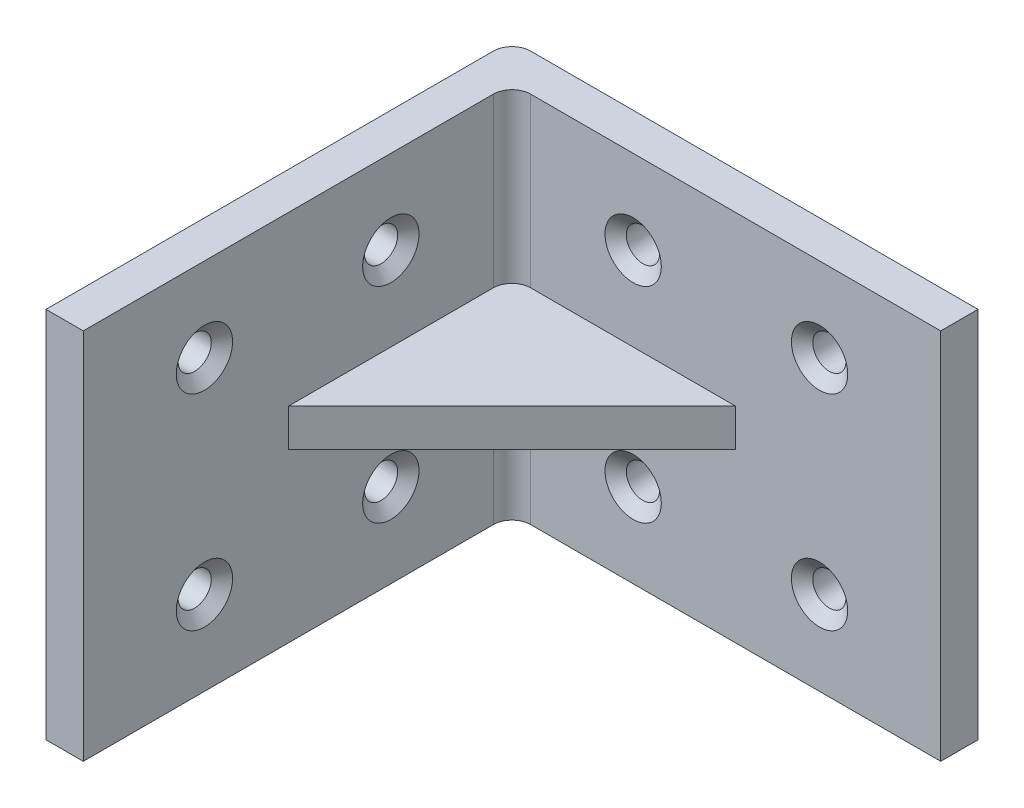
ISO-10303-21;
HEADER;
FILE_DESCRIPTION(('STEP AP214'),'2;1');
FILE_NAME('part.step','',(''),(''),'','','');
FILE_SCHEMA(('AUTOMOTIVE_DESIGN { 1 0 10303 214 1 1 1 1 }'));
ENDSEC;
DATA;
#1=APPLICATION_CONTEXT('core data for automotive mechanical design processes');
#2=APPLICATION_PROTOCOL_DEFINITION('international standard','automotive_design',2000,#1);
#3=PRODUCT_CONTEXT('',#1,'mechanical');
#4=PRODUCT('Part','Part','',(#3));
#5=PRODUCT_RELATED_PRODUCT_CATEGORY('part','',(#4));
#6=PRODUCT_DEFINITION_FORMATION('','',#4);
#7=PRODUCT_DEFINITION_CONTEXT('part definition',#1,'design');
#8=PRODUCT_DEFINITION('design','',#6,#7);
#9=PRODUCT_DEFINITION_SHAPE('','',#8);
#10=(LENGTH_UNIT() NAMED_UNIT(*) SI_UNIT(.MILLI.,.METRE.));
#11=(NAMED_UNIT(*) PLANE_ANGLE_UNIT() SI_UNIT($,.RADIAN.));
#12=(NAMED_UNIT(*) SI_UNIT($,.STERADIAN.) SOLID_ANGLE_UNIT());
#13=UNCERTAINTY_MEASURE_WITH_UNIT(LENGTH_MEASURE(1.E-05),#10,'distance_accuracy_value','');
#14=(GEOMETRIC_REPRESENTATION_CONTEXT(3) GLOBAL_UNCERTAINTY_ASSIGNED_CONTEXT((#13)) GLOBAL_UNIT_ASSIGNED_CONTEXT((#10,
#11,#12)) REPRESENTATION_CONTEXT('',''));
#15=CARTESIAN_POINT('',(0.,0.,0.));
#16=DIRECTION('',(0.,0.,1.));
#17=DIRECTION('',(1.,0.,0.));
#18=AXIS2_PLACEMENT_3D('',#15,#16,#17);
#19=CARTESIAN_POINT('',(-86.9000000000001,29.8824014274328,25.));
#20=DIRECTION('',(-1.,0.,0.));
#21=DIRECTION('',(0.,-1.,0.));
#22=AXIS2_PLACEMENT_3D('',#19,#20,#21);
#23=PLANE('',#22);
#24=DIRECTION('',(0.,1.,0.));
#25=VECTOR('',#24,1.);
#26=CARTESIAN_POINT('',(-86.9000000000001,29.8824014274328,3.));
#27=LINE('',#26,#25);
#28=CARTESIAN_POINT('',(-86.9000000000001,9.8824014274328,3.));
#29=VERTEX_POINT('',#28);
#30=CARTESIAN_POINT('',(-86.9000000000001,18.8824014274328,3.));
#31=VERTEX_POINT('',#30);
#32=EDGE_CURVE('E130',#29,#31,#27,.T.);
#33=ORIENTED_EDGE('',*,*,#32,.T.);
#34=DIRECTION('',(0.,0.,1.));
#35=VECTOR('',#34,1.);
#36=CARTESIAN_POINT('',(-86.9000000000001,18.8824014274328,25.));
#37=LINE('',#36,#35);
#38=CARTESIAN_POINT('',(-86.9000000000001,18.8824014274328,14.));
#39=VERTEX_POINT('',#38);
#40=EDGE_CURVE('E153',#31,#39,#37,.T.);
#41=ORIENTED_EDGE('',*,*,#40,.T.);
#42=DIRECTION('',(0.,-1.,0.));
#43=VECTOR('',#42,1.);
#44=CARTESIAN_POINT('',(-86.9000000000001,29.8824014274328,14.));
#45=LINE('',#44,#43);
#46=CARTESIAN_POINT('',(-86.9000000000001,20.8824014274328,14.));
#47=VERTEX_POINT('',#46);
#48=EDGE_CURVE('E11',#39,#47,#45,.F.);
#49=ORIENTED_EDGE('',*,*,#48,.T.);
#50=DIRECTION('',(0.,0.,1.));
#51=VECTOR('',#50,1.);
#52=CARTESIAN_POINT('',(-86.9000000000001,20.8824014274328,25.));
#53=LINE('',#52,#51);
#54=CARTESIAN_POINT('',(-86.9000000000001,20.8824014274328,3.));
#55=VERTEX_POINT('',#54);
#56=EDGE_CURVE('E134',#55,#47,#53,.T.);
#57=ORIENTED_EDGE('',*,*,#56,.F.);
#58=CARTESIAN_POINT('',(-86.9000000000001,29.8824014274328,3.));
#59=VERTEX_POINT('',#58);
#60=EDGE_CURVE('E120',#55,#59,#27,.T.);
#61=ORIENTED_EDGE('',*,*,#60,.T.);
#62=DIRECTION('',(0.,0.,-1.));
#63=VECTOR('',#62,1.);
#64=CARTESIAN_POINT('',(-86.9000000000001,29.8824014274328,25.));
#65=LINE('',#64,#63);
#66=CARTESIAN_POINT('',(-86.9000000000001,29.8824014274328,25.));
#67=VERTEX_POINT('',#66);
#68=EDGE_CURVE('E168',#67,#59,#65,.T.);
#69=ORIENTED_EDGE('',*,*,#68,.F.);
#70=DIRECTION('',(0.,1.,0.));
#71=VECTOR('',#70,1.);
#72=CARTESIAN_POINT('',(-86.9000000000001,29.8824014274328,25.));
#73=LINE('',#72,#71);
#74=CARTESIAN_POINT('',(-86.9000000000001,9.8824014274328,25.));
#75=VERTEX_POINT('',#74);
#76=EDGE_CURVE('E163',#75,#67,#73,.T.);
#77=ORIENTED_EDGE('',*,*,#76,.F.);
#78=DIRECTION('',(0.,0.,-1.));
#79=VECTOR('',#78,1.);
#80=CARTESIAN_POINT('',(-86.9000000000001,9.8824014274328,25.));
#81=LINE('',#80,#79);
#82=EDGE_CURVE('E188',#75,#29,#81,.T.);
#83=ORIENTED_EDGE('',*,*,#82,.T.);
#84=EDGE_LOOP('',(#33,#41,#49,#57,#61,#69,#77,#83));
#85=FACE_BOUND('',#84,.T.);
#86=CARTESIAN_POINT('',(-86.9,14.3824014274327,18.5));
#87=DIRECTION('',(1.,0.,0.));
#88=DIRECTION('',(0.,0.,-1.));
#89=AXIS2_PLACEMENT_3D('',#86,#87,#88);
#90=CIRCLE('',#89,1.5113);
#91=CARTESIAN_POINT('',(-86.9,14.3824014274327,16.9887));
#92=VERTEX_POINT('',#91);
#93=EDGE_CURVE('E235',#92,#92,#90,.T.);
#94=ORIENTED_EDGE('',*,*,#93,.F.);
#95=EDGE_LOOP('',(#94));
#96=FACE_BOUND('',#95,.T.);
#97=CARTESIAN_POINT('',(-86.9000000000001,14.3824014274328,8.49999999999998));
#98=DIRECTION('',(1.,0.,0.));
#99=DIRECTION('',(0.,0.,-1.));
#100=AXIS2_PLACEMENT_3D('',#97,#98,#99);
#101=CIRCLE('',#100,1.5113);
#102=CARTESIAN_POINT('',(-86.9000000000001,14.3824014274328,6.98869999999998));
#103=VERTEX_POINT('',#102);
#104=EDGE_CURVE('E239',#103,#103,#101,.T.);
#105=ORIENTED_EDGE('',*,*,#104,.F.);
#106=EDGE_LOOP('',(#105));
#107=FACE_BOUND('',#106,.T.);
#108=CARTESIAN_POINT('',(-86.9000000000001,25.3824014274327,18.5));
#109=DIRECTION('',(1.,0.,0.));
#110=DIRECTION('',(0.,0.,-1.));
#111=AXIS2_PLACEMENT_3D('',#108,#109,#110);
#112=CIRCLE('',#111,1.5113);
#113=CARTESIAN_POINT('',(-86.9000000000001,25.3824014274327,16.9887));
#114=VERTEX_POINT('',#113);
#115=EDGE_CURVE('E246',#114,#114,#112,.T.);
#116=ORIENTED_EDGE('',*,*,#115,.F.);
#117=EDGE_LOOP('',(#116));
#118=FACE_BOUND('',#117,.T.);
#119=CARTESIAN_POINT('',(-86.9000000000001,25.3824014274328,8.50000000000001));
#120=DIRECTION('',(1.,0.,0.));
#121=DIRECTION('',(0.,0.,-1.));
#122=AXIS2_PLACEMENT_3D('',#119,#120,#121);
#123=CIRCLE('',#122,1.5113);
#124=CARTESIAN_POINT('',(-86.9000000000001,25.3824014274328,6.98870000000001));
#125=VERTEX_POINT('',#124);
#126=EDGE_CURVE('E596',#125,#125,#123,.T.);
#127=ORIENTED_EDGE('',*,*,#126,.F.);
#128=EDGE_LOOP('',(#127));
#129=FACE_BOUND('',#128,.T.);
#130=ADVANCED_FACE('F32',(#85,#96,#107,#118,#129),#23,.F.);
#131=CARTESIAN_POINT('',(-85.9000000000001,29.8824014274328,3.));
#132=DIRECTION('',(0.,1.,0.));
#133=DIRECTION('',(-1.,0.,0.));
#134=AXIS2_PLACEMENT_3D('',#131,#132,#133);
#135=CYLINDRICAL_SURFACE('',#134,1.);
#136=CARTESIAN_POINT('',(-85.9000000000001,20.8824014274328,3.));
#137=DIRECTION('',(0.,-1.,0.));
#138=DIRECTION('',(0.,0.,-1.));
#139=AXIS2_PLACEMENT_3D('',#136,#137,#138);
#140=CIRCLE('',#139,1.);
#141=CARTESIAN_POINT('',(-85.9000000000001,20.8824014274328,2.));
#142=VERTEX_POINT('',#141);
#143=EDGE_CURVE('E125',#142,#55,#140,.F.);
#144=ORIENTED_EDGE('',*,*,#143,.F.);
#145=DIRECTION('',(0.,1.,0.));
#146=VECTOR('',#145,1.);
#147=CARTESIAN_POINT('',(-85.9000000000001,0.,2.));
#148=LINE('',#147,#146);
#149=CARTESIAN_POINT('',(-85.9000000000001,29.8824014274328,2.));
#150=VERTEX_POINT('',#149);
#151=EDGE_CURVE('E197',#150,#142,#148,.F.);
#152=ORIENTED_EDGE('',*,*,#151,.F.);
#153=CARTESIAN_POINT('',(-85.9000000000001,29.8824014274328,3.));
#154=DIRECTION('',(0.,-1.,0.));
#155=DIRECTION('',(1.,0.,0.));
#156=AXIS2_PLACEMENT_3D('',#153,#154,#155);
#157=CIRCLE('',#156,1.);
#158=EDGE_CURVE('E126',#59,#150,#157,.T.);
#159=ORIENTED_EDGE('',*,*,#158,.F.);
#160=ORIENTED_EDGE('',*,*,#60,.F.);
#161=EDGE_LOOP('',(#144,#152,#159,#160));
#162=FACE_BOUND('',#161,.T.);
#163=ADVANCED_FACE('F122',(#162),#135,.F.);
#164=CARTESIAN_POINT('',(-63.9000000000001,9.8824014274328,2.));
#165=DIRECTION('',(-1.,0.,0.));
#166=DIRECTION('',(0.,0.,1.));
#167=AXIS2_PLACEMENT_3D('',#164,#165,#166);
#168=PLANE('',#167);
#169=DIRECTION('',(0.,1.,0.));
#170=VECTOR('',#169,1.);
#171=CARTESIAN_POINT('',(-63.9000000000001,9.8824014274328,0.));
#172=LINE('',#171,#170);
#173=CARTESIAN_POINT('',(-63.9000000000001,9.8824014274328,0.));
#174=VERTEX_POINT('',#173);
#175=CARTESIAN_POINT('',(-63.9000000000001,29.8824014274328,0.));
#176=VERTEX_POINT('',#175);
#177=EDGE_CURVE('E193',#174,#176,#172,.T.);
#178=ORIENTED_EDGE('',*,*,#177,.T.);
#179=DIRECTION('',(0.,0.,-1.));
#180=VECTOR('',#179,1.);
#181=CARTESIAN_POINT('',(-63.9000000000001,29.8824014274328,2.));
#182=LINE('',#181,#180);
#183=CARTESIAN_POINT('',(-63.9000000000001,29.8824014274328,2.));
#184=VERTEX_POINT('',#183);
#185=EDGE_CURVE('E131',#184,#176,#182,.T.);
#186=ORIENTED_EDGE('',*,*,#185,.F.);
#187=DIRECTION('',(0.,1.,0.));
#188=VECTOR('',#187,1.);
#189=CARTESIAN_POINT('',(-63.9000000000001,9.8824014274328,2.));
#190=LINE('',#189,#188);
#191=CARTESIAN_POINT('',(-63.9000000000001,9.8824014274328,2.));
#192=VERTEX_POINT('',#191);
#193=EDGE_CURVE('E169',#192,#184,#190,.T.);
#194=ORIENTED_EDGE('',*,*,#193,.F.);
#195=DIRECTION('',(0.,0.,-1.));
#196=VECTOR('',#195,1.);
#197=CARTESIAN_POINT('',(-63.9000000000001,9.8824014274328,2.));
#198=LINE('',#197,#196);
#199=EDGE_CURVE('E186',#192,#174,#198,.T.);
#200=ORIENTED_EDGE('',*,*,#199,.T.);
#201=EDGE_LOOP('',(#178,#186,#194,#200));
#202=FACE_BOUND('',#201,.T.);
#203=ADVANCED_FACE('F321',(#202),#168,.F.);
#204=CARTESIAN_POINT('',(-63.9000000000001,29.8824014274328,2.));
#205=DIRECTION('',(0.,-1.,0.));
#206=DIRECTION('',(1.,0.,0.));
#207=AXIS2_PLACEMENT_3D('',#204,#205,#206);
#208=PLANE('',#207);
#209=DIRECTION('',(-1.,0.,0.));
#210=VECTOR('',#209,1.);
#211=CARTESIAN_POINT('',(-63.9000000000001,29.8824014274328,0.));
#212=LINE('',#211,#210);
#213=CARTESIAN_POINT('',(-87.9000000000001,29.8824014274328,0.));
#214=VERTEX_POINT('',#213);
#215=EDGE_CURVE('E367',#176,#214,#212,.T.);
#216=ORIENTED_EDGE('',*,*,#215,.T.);
#217=CARTESIAN_POINT('',(-87.9000000000001,29.8824014274328,1.));
#218=DIRECTION('',(0.,-1.,0.));
#219=DIRECTION('',(1.,0.,0.));
#220=AXIS2_PLACEMENT_3D('',#217,#218,#219);
#221=CIRCLE('',#220,1.);
#222=CARTESIAN_POINT('',(-88.9000000000001,29.8824014274328,1.));
#223=VERTEX_POINT('',#222);
#224=EDGE_CURVE('E204',#214,#223,#221,.F.);
#225=ORIENTED_EDGE('',*,*,#224,.T.);
#226=DIRECTION('',(0.,0.,-1.));
#227=VECTOR('',#226,1.);
#228=CARTESIAN_POINT('',(-88.9000000000001,29.8824014274328,2.));
#229=LINE('',#228,#227);
#230=CARTESIAN_POINT('',(-88.9000000000001,29.8824014274328,25.));
#231=VERTEX_POINT('',#230);
#232=EDGE_CURVE('E353',#231,#223,#229,.T.);
#233=ORIENTED_EDGE('',*,*,#232,.F.);
#234=DIRECTION('',(-1.,0.,0.));
#235=VECTOR('',#234,1.);
#236=CARTESIAN_POINT('',(-88.9000000000001,29.8824014274328,25.));
#237=LINE('',#236,#235);
#238=EDGE_CURVE('E165',#67,#231,#237,.T.);
#239=ORIENTED_EDGE('',*,*,#238,.F.);
#240=ORIENTED_EDGE('',*,*,#68,.T.);
#241=ORIENTED_EDGE('',*,*,#158,.T.);
#242=DIRECTION('',(-1.,0.,0.));
#243=VECTOR('',#242,1.);
#244=CARTESIAN_POINT('',(-63.9000000000001,29.8824014274328,2.));
#245=LINE('',#244,#243);
#246=EDGE_CURVE('E172',#184,#150,#245,.T.);
#247=ORIENTED_EDGE('',*,*,#246,.F.);
#248=ORIENTED_EDGE('',*,*,#185,.T.);
#249=EDGE_LOOP('',(#216,#225,#233,#239,#240,#241,#247,#248));
#250=FACE_BOUND('',#249,.T.);
#251=ADVANCED_FACE('F333',(#250),#208,.F.);
#252=CARTESIAN_POINT('',(-88.9000000000001,9.8824014274328,2.));
#253=DIRECTION('',(-1.,0.,0.));
#254=DIRECTION('',(0.,0.,1.));
#255=AXIS2_PLACEMENT_3D('',#252,#253,#254);
#256=PLANE('',#255);
#257=CARTESIAN_POINT('',(-88.9000000000001,25.3824014274328,8.50000000000001));
#258=DIRECTION('',(-1.,0.,0.));
#259=DIRECTION('',(0.,0.,1.));
#260=AXIS2_PLACEMENT_3D('',#257,#258,#259);
#261=CIRCLE('',#260,0.888999999999992);
#262=CARTESIAN_POINT('',(-88.9000000000001,25.3824014274328,9.389));
#263=VERTEX_POINT('',#262);
#264=EDGE_CURVE('E36',#263,#263,#261,.T.);
#265=ORIENTED_EDGE('',*,*,#264,.F.);
#266=EDGE_LOOP('',(#265));
#267=FACE_BOUND('',#266,.T.);
#268=CARTESIAN_POINT('',(-88.9000000000001,25.3824014274327,18.5));
#269=DIRECTION('',(-1.,0.,0.));
#270=DIRECTION('',(0.,0.,1.));
#271=AXIS2_PLACEMENT_3D('',#268,#269,#270);
#272=CIRCLE('',#271,0.888999999999992);
#273=CARTESIAN_POINT('',(-88.9000000000001,25.3824014274327,19.389));
#274=VERTEX_POINT('',#273);
#275=EDGE_CURVE('E237',#274,#274,#272,.T.);
#276=ORIENTED_EDGE('',*,*,#275,.F.);
#277=EDGE_LOOP('',(#276));
#278=FACE_BOUND('',#277,.T.);
#279=CARTESIAN_POINT('',(-88.9000000000001,14.3824014274328,8.49999999999998));
#280=DIRECTION('',(-1.,0.,0.));
#281=DIRECTION('',(0.,0.,1.));
#282=AXIS2_PLACEMENT_3D('',#279,#280,#281);
#283=CIRCLE('',#282,0.888999999999993);
#284=CARTESIAN_POINT('',(-88.9000000000001,14.3824014274328,9.38899999999998));
#285=VERTEX_POINT('',#284);
#286=EDGE_CURVE('E233',#285,#285,#283,.T.);
#287=ORIENTED_EDGE('',*,*,#286,.F.);
#288=EDGE_LOOP('',(#287));
#289=FACE_BOUND('',#288,.T.);
#290=CARTESIAN_POINT('',(-88.9000000000001,14.3824014274327,18.5));
#291=DIRECTION('',(-1.,0.,0.));
#292=DIRECTION('',(0.,0.,1.));
#293=AXIS2_PLACEMENT_3D('',#290,#291,#292);
#294=CIRCLE('',#293,0.888999999999993);
#295=CARTESIAN_POINT('',(-88.9000000000001,14.3824014274327,19.389));
#296=VERTEX_POINT('',#295);
#297=EDGE_CURVE('E228',#296,#296,#294,.T.);
#298=ORIENTED_EDGE('',*,*,#297,.F.);
#299=EDGE_LOOP('',(#298));
#300=FACE_BOUND('',#299,.T.);
#301=DIRECTION('',(0.,1.,0.));
#302=VECTOR('',#301,1.);
#303=CARTESIAN_POINT('',(-88.9000000000001,9.8824014274328,1.));
#304=LINE('',#303,#302);
#305=CARTESIAN_POINT('',(-88.9000000000001,9.8824014274328,1.));
#306=VERTEX_POINT('',#305);
#307=EDGE_CURVE('E206',#223,#306,#304,.F.);
#308=ORIENTED_EDGE('',*,*,#307,.T.);
#309=DIRECTION('',(0.,0.,-1.));
#310=VECTOR('',#309,1.);
#311=CARTESIAN_POINT('',(-88.9000000000001,9.8824014274328,2.));
#312=LINE('',#311,#310);
#313=CARTESIAN_POINT('',(-88.9000000000001,9.8824014274328,25.));
#314=VERTEX_POINT('',#313);
#315=EDGE_CURVE('E356',#314,#306,#312,.T.);
#316=ORIENTED_EDGE('',*,*,#315,.F.);
#317=DIRECTION('',(0.,-1.,0.));
#318=VECTOR('',#317,1.);
#319=CARTESIAN_POINT('',(-88.9000000000001,29.8824014274328,25.));
#320=LINE('',#319,#318);
#321=EDGE_CURVE('E158',#231,#314,#320,.T.);
#322=ORIENTED_EDGE('',*,*,#321,.F.);
#323=ORIENTED_EDGE('',*,*,#232,.T.);
#324=EDGE_LOOP('',(#308,#316,#322,#323));
#325=FACE_BOUND('',#324,.T.);
#326=ADVANCED_FACE('F329',(#267,#278,#289,#300,#325),#256,.T.);
#327=CARTESIAN_POINT('',(-63.9000000000001,9.8824014274328,2.));
#328=DIRECTION('',(0.,-1.,0.));
#329=DIRECTION('',(0.,0.,-1.));
#330=AXIS2_PLACEMENT_3D('',#327,#328,#329);
#331=PLANE('',#330);
#332=ORIENTED_EDGE('',*,*,#315,.T.);
#333=CARTESIAN_POINT('',(-87.9000000000001,9.8824014274328,1.));
#334=DIRECTION('',(0.,-1.,0.));
#335=DIRECTION('',(0.,0.,-1.));
#336=AXIS2_PLACEMENT_3D('',#333,#334,#335);
#337=CIRCLE('',#336,1.);
#338=CARTESIAN_POINT('',(-87.9000000000001,9.8824014274328,0.));
#339=VERTEX_POINT('',#338);
#340=EDGE_CURVE('E41',#306,#339,#337,.T.);
#341=ORIENTED_EDGE('',*,*,#340,.T.);
#342=DIRECTION('',(-1.,0.,0.));
#343=VECTOR('',#342,1.);
#344=CARTESIAN_POINT('',(-63.9000000000001,9.8824014274328,0.));
#345=LINE('',#344,#343);
#346=EDGE_CURVE('E173',#174,#339,#345,.T.);
#347=ORIENTED_EDGE('',*,*,#346,.F.);
#348=ORIENTED_EDGE('',*,*,#199,.F.);
#349=DIRECTION('',(-1.,0.,0.));
#350=VECTOR('',#349,1.);
#351=CARTESIAN_POINT('',(-63.9000000000001,9.8824014274328,2.));
#352=LINE('',#351,#350);
#353=CARTESIAN_POINT('',(-85.9000000000001,9.8824014274328,2.));
#354=VERTEX_POINT('',#353);
#355=EDGE_CURVE('E182',#192,#354,#352,.T.);
#356=ORIENTED_EDGE('',*,*,#355,.T.);
#357=CARTESIAN_POINT('',(-85.9000000000001,9.8824014274328,3.));
#358=DIRECTION('',(0.,-1.,0.));
#359=DIRECTION('',(0.,0.,-1.));
#360=AXIS2_PLACEMENT_3D('',#357,#358,#359);
#361=CIRCLE('',#360,1.);
#362=EDGE_CURVE('E200',#354,#29,#361,.F.);
#363=ORIENTED_EDGE('',*,*,#362,.T.);
#364=ORIENTED_EDGE('',*,*,#82,.F.);
#365=DIRECTION('',(1.,0.,0.));
#366=VECTOR('',#365,1.);
#367=CARTESIAN_POINT('',(-88.9000000000001,9.8824014274328,25.));
#368=LINE('',#367,#366);
#369=EDGE_CURVE('E161',#314,#75,#368,.T.);
#370=ORIENTED_EDGE('',*,*,#369,.F.);
#371=EDGE_LOOP('',(#332,#341,#347,#348,#356,#363,#364,#370));
#372=FACE_BOUND('',#371,.T.);
#373=ADVANCED_FACE('F290',(#372),#331,.T.);
#374=CARTESIAN_POINT('',(0.,0.,2.));
#375=DIRECTION('',(0.,0.,1.));
#376=DIRECTION('',(1.,0.,0.));
#377=AXIS2_PLACEMENT_3D('',#374,#375,#376);
#378=PLANE('',#377);
#379=CARTESIAN_POINT('',(-80.4000000000001,25.3824014274328,2.));
#380=DIRECTION('',(0.,0.,1.));
#381=DIRECTION('',(1.,0.,0.));
#382=AXIS2_PLACEMENT_3D('',#379,#380,#381);
#383=CIRCLE('',#382,1.51129999999999);
#384=CARTESIAN_POINT('',(-78.8887000000001,25.3824014274328,2.));
#385=VERTEX_POINT('',#384);
#386=EDGE_CURVE('E231',#385,#385,#383,.T.);
#387=ORIENTED_EDGE('',*,*,#386,.F.);
#388=EDGE_LOOP('',(#387));
#389=FACE_BOUND('',#388,.T.);
#390=CARTESIAN_POINT('',(-70.4000000000001,25.3824014274328,2.));
#391=DIRECTION('',(0.,0.,1.));
#392=DIRECTION('',(1.,0.,0.));
#393=AXIS2_PLACEMENT_3D('',#390,#391,#392);
#394=CIRCLE('',#393,1.51130000000001);
#395=CARTESIAN_POINT('',(-68.8887000000001,25.3824014274328,2.));
#396=VERTEX_POINT('',#395);
#397=EDGE_CURVE('E226',#396,#396,#394,.T.);
#398=ORIENTED_EDGE('',*,*,#397,.F.);
#399=EDGE_LOOP('',(#398));
#400=FACE_BOUND('',#399,.T.);
#401=CARTESIAN_POINT('',(-80.4000000000001,14.3824014274328,2.));
#402=DIRECTION('',(0.,0.,1.));
#403=DIRECTION('',(1.,0.,0.));
#404=AXIS2_PLACEMENT_3D('',#401,#402,#403);
#405=CIRCLE('',#404,1.51129999999999);
#406=CARTESIAN_POINT('',(-78.8887000000001,14.3824014274328,2.));
#407=VERTEX_POINT('',#406);
#408=EDGE_CURVE('E221',#407,#407,#405,.T.);
#409=ORIENTED_EDGE('',*,*,#408,.F.);
#410=EDGE_LOOP('',(#409));
#411=FACE_BOUND('',#410,.T.);
#412=CARTESIAN_POINT('',(-70.4000000000001,14.3824014274328,2.));
#413=DIRECTION('',(0.,0.,1.));
#414=DIRECTION('',(1.,0.,0.));
#415=AXIS2_PLACEMENT_3D('',#412,#413,#414);
#416=CIRCLE('',#415,1.51130000000001);
#417=CARTESIAN_POINT('',(-68.8887000000001,14.3824014274328,2.));
#418=VERTEX_POINT('',#417);
#419=EDGE_CURVE('E216',#418,#418,#416,.T.);
#420=ORIENTED_EDGE('',*,*,#419,.F.);
#421=EDGE_LOOP('',(#420));
#422=FACE_BOUND('',#421,.T.);
#423=DIRECTION('',(1.,0.,0.));
#424=VECTOR('',#423,1.);
#425=CARTESIAN_POINT('',(0.,18.8824014274328,2.));
#426=LINE('',#425,#424);
#427=CARTESIAN_POINT('',(-85.9000000000001,18.8824014274328,2.));
#428=VERTEX_POINT('',#427);
#429=CARTESIAN_POINT('',(-74.9000000000001,18.8824014274328,2.));
#430=VERTEX_POINT('',#429);
#431=EDGE_CURVE('E155',#428,#430,#426,.T.);
#432=ORIENTED_EDGE('',*,*,#431,.F.);
#433=EDGE_CURVE('E196',#428,#354,#148,.F.);
#434=ORIENTED_EDGE('',*,*,#433,.T.);
#435=ORIENTED_EDGE('',*,*,#355,.F.);
#436=ORIENTED_EDGE('',*,*,#193,.T.);
#437=ORIENTED_EDGE('',*,*,#246,.T.);
#438=ORIENTED_EDGE('',*,*,#151,.T.);
#439=DIRECTION('',(1.,0.,0.));
#440=VECTOR('',#439,1.);
#441=CARTESIAN_POINT('',(0.,20.8824014274328,2.));
#442=LINE('',#441,#440);
#443=CARTESIAN_POINT('',(-74.9000000000001,20.8824014274328,2.));
#444=VERTEX_POINT('',#443);
#445=EDGE_CURVE('E54',#142,#444,#442,.T.);
#446=ORIENTED_EDGE('',*,*,#445,.T.);
#447=DIRECTION('',(0.,-1.,0.));
#448=VECTOR('',#447,1.);
#449=CARTESIAN_POINT('',(-74.9000000000001,0.,2.));
#450=LINE('',#449,#448);
#451=EDGE_CURVE('E49',#430,#444,#450,.F.);
#452=ORIENTED_EDGE('',*,*,#451,.F.);
#453=EDGE_LOOP('',(#432,#434,#435,#436,#437,#438,#446,#452));
#454=FACE_BOUND('',#453,.T.);
#455=ADVANCED_FACE('F287',(#389,#400,#411,#422,#454),#378,.T.);
#456=CARTESIAN_POINT('',(0.,0.,0.));
#457=DIRECTION('',(0.,0.,1.));
#458=DIRECTION('',(1.,0.,0.));
#459=AXIS2_PLACEMENT_3D('',#456,#457,#458);
#460=PLANE('',#459);
#461=CARTESIAN_POINT('',(-80.4000000000001,25.3824014274328,0.));
#462=DIRECTION('',(0.,0.,1.));
#463=DIRECTION('',(1.,0.,0.));
#464=AXIS2_PLACEMENT_3D('',#461,#462,#463);
#465=CIRCLE('',#464,0.888999999999994);
#466=CARTESIAN_POINT('',(-79.5110000000001,25.3824014274328,0.));
#467=VERTEX_POINT('',#466);
#468=EDGE_CURVE('E223',#467,#467,#465,.T.);
#469=ORIENTED_EDGE('',*,*,#468,.T.);
#470=EDGE_LOOP('',(#469));
#471=FACE_BOUND('',#470,.T.);
#472=CARTESIAN_POINT('',(-70.4000000000001,25.3824014274328,0.));
#473=DIRECTION('',(0.,0.,1.));
#474=DIRECTION('',(1.,0.,0.));
#475=AXIS2_PLACEMENT_3D('',#472,#473,#474);
#476=CIRCLE('',#475,0.888999999999994);
#477=CARTESIAN_POINT('',(-69.5110000000001,25.3824014274328,0.));
#478=VERTEX_POINT('',#477);
#479=EDGE_CURVE('E218',#478,#478,#476,.T.);
#480=ORIENTED_EDGE('',*,*,#479,.T.);
#481=EDGE_LOOP('',(#480));
#482=FACE_BOUND('',#481,.T.);
#483=CARTESIAN_POINT('',(-80.4000000000001,14.3824014274328,0.));
#484=DIRECTION('',(0.,0.,1.));
#485=DIRECTION('',(1.,0.,0.));
#486=AXIS2_PLACEMENT_3D('',#483,#484,#485);
#487=CIRCLE('',#486,0.888999999999994);
#488=CARTESIAN_POINT('',(-79.5110000000001,14.3824014274328,0.));
#489=VERTEX_POINT('',#488);
#490=EDGE_CURVE('E213',#489,#489,#487,.T.);
#491=ORIENTED_EDGE('',*,*,#490,.T.);
#492=EDGE_LOOP('',(#491));
#493=FACE_BOUND('',#492,.T.);
#494=CARTESIAN_POINT('',(-70.4000000000001,14.3824014274328,0.));
#495=DIRECTION('',(0.,0.,1.));
#496=DIRECTION('',(1.,0.,0.));
#497=AXIS2_PLACEMENT_3D('',#494,#495,#496);
#498=CIRCLE('',#497,0.888999999999994);
#499=CARTESIAN_POINT('',(-69.5110000000001,14.3824014274328,0.));
#500=VERTEX_POINT('',#499);
#501=EDGE_CURVE('E209',#500,#500,#498,.T.);
#502=ORIENTED_EDGE('',*,*,#501,.T.);
#503=EDGE_LOOP('',(#502));
#504=FACE_BOUND('',#503,.T.);
#505=DIRECTION('',(0.,1.,0.));
#506=VECTOR('',#505,1.);
#507=CARTESIAN_POINT('',(-87.9000000000001,29.8824014274328,0.));
#508=LINE('',#507,#506);
#509=EDGE_CURVE('E202',#339,#214,#508,.T.);
#510=ORIENTED_EDGE('',*,*,#509,.T.);
#511=ORIENTED_EDGE('',*,*,#215,.F.);
#512=ORIENTED_EDGE('',*,*,#177,.F.);
#513=ORIENTED_EDGE('',*,*,#346,.T.);
#514=EDGE_LOOP('',(#510,#511,#512,#513));
#515=FACE_BOUND('',#514,.T.);
#516=ADVANCED_FACE('F289',(#471,#482,#493,#504,#515),#460,.F.);
#517=CARTESIAN_POINT('',(0.,0.,25.));
#518=DIRECTION('',(0.,0.,1.));
#519=DIRECTION('',(1.,0.,0.));
#520=AXIS2_PLACEMENT_3D('',#517,#518,#519);
#521=PLANE('',#520);
#522=ORIENTED_EDGE('',*,*,#321,.T.);
#523=ORIENTED_EDGE('',*,*,#369,.T.);
#524=ORIENTED_EDGE('',*,*,#76,.T.);
#525=ORIENTED_EDGE('',*,*,#238,.T.);
#526=EDGE_LOOP('',(#522,#523,#524,#525));
#527=FACE_BOUND('',#526,.T.);
#528=ADVANCED_FACE('F322',(#527),#521,.T.);
#529=ORIENTED_EDGE('',*,*,#433,.F.);
#530=CARTESIAN_POINT('',(-85.9000000000001,18.8824014274328,3.));
#531=DIRECTION('',(0.,-1.,0.));
#532=DIRECTION('',(0.,0.,-1.));
#533=AXIS2_PLACEMENT_3D('',#530,#531,#532);
#534=CIRCLE('',#533,1.);
#535=EDGE_CURVE('E151',#428,#31,#534,.F.);
#536=ORIENTED_EDGE('',*,*,#535,.T.);
#537=ORIENTED_EDGE('',*,*,#32,.F.);
#538=ORIENTED_EDGE('',*,*,#362,.F.);
#539=EDGE_LOOP('',(#529,#536,#537,#538));
#540=FACE_BOUND('',#539,.T.);
#541=ADVANCED_FACE('F300',(#540),#135,.F.);
#542=CARTESIAN_POINT('',(-87.9000000000001,0.,1.));
#543=DIRECTION('',(0.,-1.,0.));
#544=DIRECTION('',(0.,0.,-1.));
#545=AXIS2_PLACEMENT_3D('',#542,#543,#544);
#546=CYLINDRICAL_SURFACE('',#545,1.);
#547=ORIENTED_EDGE('',*,*,#340,.F.);
#548=ORIENTED_EDGE('',*,*,#307,.F.);
#549=ORIENTED_EDGE('',*,*,#224,.F.);
#550=ORIENTED_EDGE('',*,*,#509,.F.);
#551=EDGE_LOOP('',(#547,#548,#549,#550));
#552=FACE_BOUND('',#551,.T.);
#553=ADVANCED_FACE('F34',(#552),#546,.T.);
#554=CARTESIAN_POINT('',(-86.9000000000001,19.8824014274328,14.));
#555=DIRECTION('',(-0.707106781186548,0.,-0.707106781186547));
#556=DIRECTION('',(0.707106781186547,0.,-0.707106781186548));
#557=AXIS2_PLACEMENT_3D('',#554,#555,#556);
#558=PLANE('',#557);
#559=DIRECTION('',(0.707106781186547,0.,-0.707106781186548));
#560=VECTOR('',#559,1.);
#561=CARTESIAN_POINT('',(-86.9000000000001,18.8824014274328,14.));
#562=LINE('',#561,#560);
#563=EDGE_CURVE('E143',#39,#430,#562,.T.);
#564=ORIENTED_EDGE('',*,*,#563,.T.);
#565=ORIENTED_EDGE('',*,*,#451,.T.);
#566=DIRECTION('',(0.707106781186547,0.,-0.707106781186548));
#567=VECTOR('',#566,1.);
#568=CARTESIAN_POINT('',(-86.9000000000001,20.8824014274328,14.));
#569=LINE('',#568,#567);
#570=EDGE_CURVE('E146',#47,#444,#569,.T.);
#571=ORIENTED_EDGE('',*,*,#570,.F.);
#572=ORIENTED_EDGE('',*,*,#48,.F.);
#573=EDGE_LOOP('',(#564,#565,#571,#572));
#574=FACE_BOUND('',#573,.T.);
#575=ADVANCED_FACE('F305',(#574),#558,.F.);
#576=CARTESIAN_POINT('',(-76.4000000000001,18.8824014274328,12.5));
#577=DIRECTION('',(0.,-1.,0.));
#578=DIRECTION('',(0.,0.,-1.));
#579=AXIS2_PLACEMENT_3D('',#576,#577,#578);
#580=PLANE('',#579);
#581=ORIENTED_EDGE('',*,*,#535,.F.);
#582=ORIENTED_EDGE('',*,*,#431,.T.);
#583=ORIENTED_EDGE('',*,*,#563,.F.);
#584=ORIENTED_EDGE('',*,*,#40,.F.);
#585=EDGE_LOOP('',(#581,#582,#583,#584));
#586=FACE_BOUND('',#585,.T.);
#587=ADVANCED_FACE('F303',(#586),#580,.T.);
#588=CARTESIAN_POINT('',(-76.4000000000001,20.8824014274328,12.5));
#589=DIRECTION('',(0.,-1.,0.));
#590=DIRECTION('',(0.,0.,-1.));
#591=AXIS2_PLACEMENT_3D('',#588,#589,#590);
#592=PLANE('',#591);
#593=ORIENTED_EDGE('',*,*,#445,.F.);
#594=ORIENTED_EDGE('',*,*,#143,.T.);
#595=ORIENTED_EDGE('',*,*,#56,.T.);
#596=ORIENTED_EDGE('',*,*,#570,.T.);
#597=EDGE_LOOP('',(#593,#594,#595,#596));
#598=FACE_BOUND('',#597,.T.);
#599=ADVANCED_FACE('F142',(#598),#592,.F.);
#600=CARTESIAN_POINT('',(-70.4000000000001,14.3824014274328,2.));
#601=DIRECTION('',(0.,0.,1.));
#602=DIRECTION('',(1.,0.,0.));
#603=AXIS2_PLACEMENT_3D('',#600,#601,#602);
#604=CYLINDRICAL_SURFACE('',#603,0.888999999999994);
#605=CARTESIAN_POINT('',(-70.4000000000001,14.3824014274328,1.47782829951838));
#606=DIRECTION('',(0.,0.,1.));
#607=DIRECTION('',(1.,0.,0.));
#608=AXIS2_PLACEMENT_3D('',#605,#606,#607);
#609=CIRCLE('',#608,0.889000000000001);
#610=CARTESIAN_POINT('',(-69.5110000000001,14.3824014274328,1.47782829951838));
#611=VERTEX_POINT('',#610);
#612=EDGE_CURVE('E212',#611,#611,#609,.T.);
#613=ORIENTED_EDGE('',*,*,#612,.T.);
#614=EDGE_LOOP('',(#613));
#615=FACE_BOUND('',#614,.T.);
#616=ORIENTED_EDGE('',*,*,#501,.F.);
#617=EDGE_LOOP('',(#616));
#618=FACE_BOUND('',#617,.T.);
#619=ADVANCED_FACE('F277',(#615,#618),#604,.F.);
#620=CARTESIAN_POINT('',(-70.4000000000001,14.3824014274328,2.));
#621=DIRECTION('',(0.,0.,1.));
#622=DIRECTION('',(1.,0.,0.));
#623=AXIS2_PLACEMENT_3D('',#620,#621,#622);
#624=CONICAL_SURFACE('',#623,1.51130000000001,0.872664625997165);
#625=ORIENTED_EDGE('',*,*,#612,.F.);
#626=EDGE_LOOP('',(#625));
#627=FACE_BOUND('',#626,.T.);
#628=ORIENTED_EDGE('',*,*,#419,.T.);
#629=EDGE_LOOP('',(#628));
#630=FACE_BOUND('',#629,.T.);
#631=ADVANCED_FACE('F280',(#627,#630),#624,.F.);
#632=CARTESIAN_POINT('',(-80.4000000000001,14.3824014274328,2.));
#633=DIRECTION('',(0.,0.,1.));
#634=DIRECTION('',(1.,0.,0.));
#635=AXIS2_PLACEMENT_3D('',#632,#633,#634);
#636=CYLINDRICAL_SURFACE('',#635,0.888999999999994);
#637=CARTESIAN_POINT('',(-80.4000000000001,14.3824014274328,1.47782829951838));
#638=DIRECTION('',(0.,0.,1.));
#639=DIRECTION('',(1.,0.,0.));
#640=AXIS2_PLACEMENT_3D('',#637,#638,#639);
#641=CIRCLE('',#640,0.889000000000001);
#642=CARTESIAN_POINT('',(-79.5110000000001,14.3824014274328,1.47782829951838));
#643=VERTEX_POINT('',#642);
#644=EDGE_CURVE('E217',#643,#643,#641,.T.);
#645=ORIENTED_EDGE('',*,*,#644,.T.);
#646=EDGE_LOOP('',(#645));
#647=FACE_BOUND('',#646,.T.);
#648=ORIENTED_EDGE('',*,*,#490,.F.);
#649=EDGE_LOOP('',(#648));
#650=FACE_BOUND('',#649,.T.);
#651=ADVANCED_FACE('F283',(#647,#650),#636,.F.);
#652=CARTESIAN_POINT('',(-80.4000000000001,14.3824014274328,2.));
#653=DIRECTION('',(0.,0.,1.));
#654=DIRECTION('',(1.,0.,0.));
#655=AXIS2_PLACEMENT_3D('',#652,#653,#654);
#656=CONICAL_SURFACE('',#655,1.51129999999999,0.872664625997154);
#657=ORIENTED_EDGE('',*,*,#644,.F.);
#658=EDGE_LOOP('',(#657));
#659=FACE_BOUND('',#658,.T.);
#660=ORIENTED_EDGE('',*,*,#408,.T.);
#661=EDGE_LOOP('',(#660));
#662=FACE_BOUND('',#661,.T.);
#663=ADVANCED_FACE('F455',(#659,#662),#656,.F.);
#664=CARTESIAN_POINT('',(-70.4000000000001,25.3824014274328,2.));
#665=DIRECTION('',(0.,0.,1.));
#666=DIRECTION('',(1.,0.,0.));
#667=AXIS2_PLACEMENT_3D('',#664,#665,#666);
#668=CYLINDRICAL_SURFACE('',#667,0.888999999999994);
#669=CARTESIAN_POINT('',(-70.4000000000001,25.3824014274328,1.47782829951838));
#670=DIRECTION('',(0.,0.,1.));
#671=DIRECTION('',(1.,0.,0.));
#672=AXIS2_PLACEMENT_3D('',#669,#670,#671);
#673=CIRCLE('',#672,0.889000000000001);
#674=CARTESIAN_POINT('',(-69.5110000000001,25.3824014274328,1.47782829951838));
#675=VERTEX_POINT('',#674);
#676=EDGE_CURVE('E222',#675,#675,#673,.T.);
#677=ORIENTED_EDGE('',*,*,#676,.T.);
#678=EDGE_LOOP('',(#677));
#679=FACE_BOUND('',#678,.T.);
#680=ORIENTED_EDGE('',*,*,#479,.F.);
#681=EDGE_LOOP('',(#680));
#682=FACE_BOUND('',#681,.T.);
#683=ADVANCED_FACE('F464',(#679,#682),#668,.F.);
#684=CARTESIAN_POINT('',(-70.4000000000001,25.3824014274328,2.));
#685=DIRECTION('',(0.,0.,1.));
#686=DIRECTION('',(1.,0.,0.));
#687=AXIS2_PLACEMENT_3D('',#684,#685,#686);
#688=CONICAL_SURFACE('',#687,1.51130000000001,0.872664625997165);
#689=ORIENTED_EDGE('',*,*,#676,.F.);
#690=EDGE_LOOP('',(#689));
#691=FACE_BOUND('',#690,.T.);
#692=ORIENTED_EDGE('',*,*,#397,.T.);
#693=EDGE_LOOP('',(#692));
#694=FACE_BOUND('',#693,.T.);
#695=ADVANCED_FACE('F474',(#691,#694),#688,.F.);
#696=CARTESIAN_POINT('',(-80.4000000000001,25.3824014274328,2.));
#697=DIRECTION('',(0.,0.,1.));
#698=DIRECTION('',(1.,0.,0.));
#699=AXIS2_PLACEMENT_3D('',#696,#697,#698);
#700=CYLINDRICAL_SURFACE('',#699,0.888999999999994);
#701=CARTESIAN_POINT('',(-80.4000000000001,25.3824014274328,1.47782829951838));
#702=DIRECTION('',(0.,0.,1.));
#703=DIRECTION('',(1.,0.,0.));
#704=AXIS2_PLACEMENT_3D('',#701,#702,#703);
#705=CIRCLE('',#704,0.889000000000001);
#706=CARTESIAN_POINT('',(-79.5110000000001,25.3824014274328,1.47782829951838));
#707=VERTEX_POINT('',#706);
#708=EDGE_CURVE('E227',#707,#707,#705,.T.);
#709=ORIENTED_EDGE('',*,*,#708,.T.);
#710=EDGE_LOOP('',(#709));
#711=FACE_BOUND('',#710,.T.);
#712=ORIENTED_EDGE('',*,*,#468,.F.);
#713=EDGE_LOOP('',(#712));
#714=FACE_BOUND('',#713,.T.);
#715=ADVANCED_FACE('F481',(#711,#714),#700,.F.);
#716=CARTESIAN_POINT('',(-80.4000000000001,25.3824014274328,2.));
#717=DIRECTION('',(0.,0.,1.));
#718=DIRECTION('',(1.,0.,0.));
#719=AXIS2_PLACEMENT_3D('',#716,#717,#718);
#720=CONICAL_SURFACE('',#719,1.51129999999999,0.872664625997154);
#721=ORIENTED_EDGE('',*,*,#708,.F.);
#722=EDGE_LOOP('',(#721));
#723=FACE_BOUND('',#722,.T.);
#724=ORIENTED_EDGE('',*,*,#386,.T.);
#725=EDGE_LOOP('',(#724));
#726=FACE_BOUND('',#725,.T.);
#727=ADVANCED_FACE('F489',(#723,#726),#720,.F.);
#728=CARTESIAN_POINT('',(-86.9,14.3824014274327,18.5));
#729=DIRECTION('',(1.,0.,0.));
#730=DIRECTION('',(0.,0.,-1.));
#731=AXIS2_PLACEMENT_3D('',#728,#729,#730);
#732=CYLINDRICAL_SURFACE('',#731,0.888999999999993);
#733=ORIENTED_EDGE('',*,*,#297,.T.);
#734=EDGE_LOOP('',(#733));
#735=FACE_BOUND('',#734,.T.);
#736=CARTESIAN_POINT('',(-87.4221717004817,14.3824014274327,18.5));
#737=DIRECTION('',(1.,0.,0.));
#738=DIRECTION('',(0.,0.,-1.));
#739=AXIS2_PLACEMENT_3D('',#736,#737,#738);
#740=CIRCLE('',#739,0.888999999999999);
#741=CARTESIAN_POINT('',(-87.4221717004817,14.3824014274327,17.611));
#742=VERTEX_POINT('',#741);
#743=EDGE_CURVE('E232',#742,#742,#740,.T.);
#744=ORIENTED_EDGE('',*,*,#743,.T.);
#745=EDGE_LOOP('',(#744));
#746=FACE_BOUND('',#745,.T.);
#747=ADVANCED_FACE('F497',(#735,#746),#732,.F.);
#748=CARTESIAN_POINT('',(-86.9,14.3824014274327,18.5));
#749=DIRECTION('',(1.,0.,0.));
#750=DIRECTION('',(0.,0.,-1.));
#751=AXIS2_PLACEMENT_3D('',#748,#749,#750);
#752=CONICAL_SURFACE('',#751,1.5113,0.872664625997168);
#753=ORIENTED_EDGE('',*,*,#743,.F.);
#754=EDGE_LOOP('',(#753));
#755=FACE_BOUND('',#754,.T.);
#756=ORIENTED_EDGE('',*,*,#93,.T.);
#757=EDGE_LOOP('',(#756));
#758=FACE_BOUND('',#757,.T.);
#759=ADVANCED_FACE('F504',(#755,#758),#752,.F.);
#760=CARTESIAN_POINT('',(-86.9000000000001,14.3824014274328,8.49999999999998));
#761=DIRECTION('',(1.,0.,0.));
#762=DIRECTION('',(0.,0.,-1.));
#763=AXIS2_PLACEMENT_3D('',#760,#761,#762);
#764=CYLINDRICAL_SURFACE('',#763,0.888999999999993);
#765=ORIENTED_EDGE('',*,*,#286,.T.);
#766=EDGE_LOOP('',(#765));
#767=FACE_BOUND('',#766,.T.);
#768=CARTESIAN_POINT('',(-87.4221717004817,14.3824014274328,8.49999999999998));
#769=DIRECTION('',(1.,0.,0.));
#770=DIRECTION('',(0.,0.,-1.));
#771=AXIS2_PLACEMENT_3D('',#768,#769,#770);
#772=CIRCLE('',#771,0.888999999999999);
#773=CARTESIAN_POINT('',(-87.4221717004817,14.3824014274328,7.61099999999998));
#774=VERTEX_POINT('',#773);
#775=EDGE_CURVE('E236',#774,#774,#772,.T.);
#776=ORIENTED_EDGE('',*,*,#775,.T.);
#777=EDGE_LOOP('',(#776));
#778=FACE_BOUND('',#777,.T.);
#779=ADVANCED_FACE('F512',(#767,#778),#764,.F.);
#780=CARTESIAN_POINT('',(-86.9000000000001,14.3824014274328,8.49999999999998));
#781=DIRECTION('',(1.,0.,0.));
#782=DIRECTION('',(0.,0.,-1.));
#783=AXIS2_PLACEMENT_3D('',#780,#781,#782);
#784=CONICAL_SURFACE('',#783,1.5113,0.872664625997168);
#785=ORIENTED_EDGE('',*,*,#775,.F.);
#786=EDGE_LOOP('',(#785));
#787=FACE_BOUND('',#786,.T.);
#788=ORIENTED_EDGE('',*,*,#104,.T.);
#789=EDGE_LOOP('',(#788));
#790=FACE_BOUND('',#789,.T.);
#791=ADVANCED_FACE('F520',(#787,#790),#784,.F.);
#792=CARTESIAN_POINT('',(-86.9000000000001,25.3824014274327,18.5));
#793=DIRECTION('',(1.,0.,0.));
#794=DIRECTION('',(0.,0.,-1.));
#795=AXIS2_PLACEMENT_3D('',#792,#793,#794);
#796=CYLINDRICAL_SURFACE('',#795,0.888999999999992);
#797=ORIENTED_EDGE('',*,*,#275,.T.);
#798=EDGE_LOOP('',(#797));
#799=FACE_BOUND('',#798,.T.);
#800=CARTESIAN_POINT('',(-87.4221717004817,25.3824014274327,18.5));
#801=DIRECTION('',(1.,0.,0.));
#802=DIRECTION('',(0.,0.,-1.));
#803=AXIS2_PLACEMENT_3D('',#800,#801,#802);
#804=CIRCLE('',#803,0.888999999999997);
#805=CARTESIAN_POINT('',(-87.4221717004817,25.3824014274327,17.611));
#806=VERTEX_POINT('',#805);
#807=EDGE_CURVE('E240',#806,#806,#804,.T.);
#808=ORIENTED_EDGE('',*,*,#807,.T.);
#809=EDGE_LOOP('',(#808));
#810=FACE_BOUND('',#809,.T.);
#811=ADVANCED_FACE('F528',(#799,#810),#796,.F.);
#812=CARTESIAN_POINT('',(-86.9000000000001,25.3824014274327,18.5));
#813=DIRECTION('',(1.,0.,0.));
#814=DIRECTION('',(0.,0.,-1.));
#815=AXIS2_PLACEMENT_3D('',#812,#813,#814);
#816=CONICAL_SURFACE('',#815,1.5113,0.872664625997169);
#817=ORIENTED_EDGE('',*,*,#807,.F.);
#818=EDGE_LOOP('',(#817));
#819=FACE_BOUND('',#818,.T.);
#820=ORIENTED_EDGE('',*,*,#115,.T.);
#821=EDGE_LOOP('',(#820));
#822=FACE_BOUND('',#821,.T.);
#823=ADVANCED_FACE('F536',(#819,#822),#816,.F.);
#824=CARTESIAN_POINT('',(-86.9000000000001,25.3824014274328,8.50000000000001));
#825=DIRECTION('',(1.,0.,0.));
#826=DIRECTION('',(0.,0.,-1.));
#827=AXIS2_PLACEMENT_3D('',#824,#825,#826);
#828=CYLINDRICAL_SURFACE('',#827,0.888999999999992);
#829=ORIENTED_EDGE('',*,*,#264,.T.);
#830=EDGE_LOOP('',(#829));
#831=FACE_BOUND('',#830,.T.);
#832=CARTESIAN_POINT('',(-87.4221717004817,25.3824014274328,8.50000000000001));
#833=DIRECTION('',(1.,0.,0.));
#834=DIRECTION('',(0.,0.,-1.));
#835=AXIS2_PLACEMENT_3D('',#832,#833,#834);
#836=CIRCLE('',#835,0.888999999999997);
#837=CARTESIAN_POINT('',(-87.4221717004817,25.3824014274328,7.61100000000001));
#838=VERTEX_POINT('',#837);
#839=EDGE_CURVE('E593',#838,#838,#836,.T.);
#840=ORIENTED_EDGE('',*,*,#839,.T.);
#841=EDGE_LOOP('',(#840));
#842=FACE_BOUND('',#841,.T.);
#843=ADVANCED_FACE('F543',(#831,#842),#828,.F.);
#844=CARTESIAN_POINT('',(-86.9000000000001,25.3824014274328,8.50000000000001));
#845=DIRECTION('',(1.,0.,0.));
#846=DIRECTION('',(0.,0.,-1.));
#847=AXIS2_PLACEMENT_3D('',#844,#845,#846);
#848=CONICAL_SURFACE('',#847,1.5113,0.872664625997169);
#849=ORIENTED_EDGE('',*,*,#839,.F.);
#850=EDGE_LOOP('',(#849));
#851=FACE_BOUND('',#850,.T.);
#852=ORIENTED_EDGE('',*,*,#126,.T.);
#853=EDGE_LOOP('',(#852));
#854=FACE_BOUND('',#853,.T.);
#855=ADVANCED_FACE('F551',(#851,#854),#848,.F.);
#856=CLOSED_SHELL('',(#130,#163,#203,#251,#326,#373,#455,#516,#528,#541,#553,#575,#587,#599,
#619,#631,#651,#663,#683,#695,#715,#727,#747,#759,#779,#791,#811,#823,#843,#855));
#857=MANIFOLD_SOLID_BREP('B2',#856);
#858=ADVANCED_BREP_SHAPE_REPRESENTATION('',(#18,#857),#14);
#859=SHAPE_DEFINITION_REPRESENTATION(#9,#858);
ENDSEC;
END-ISO-10303-21;
